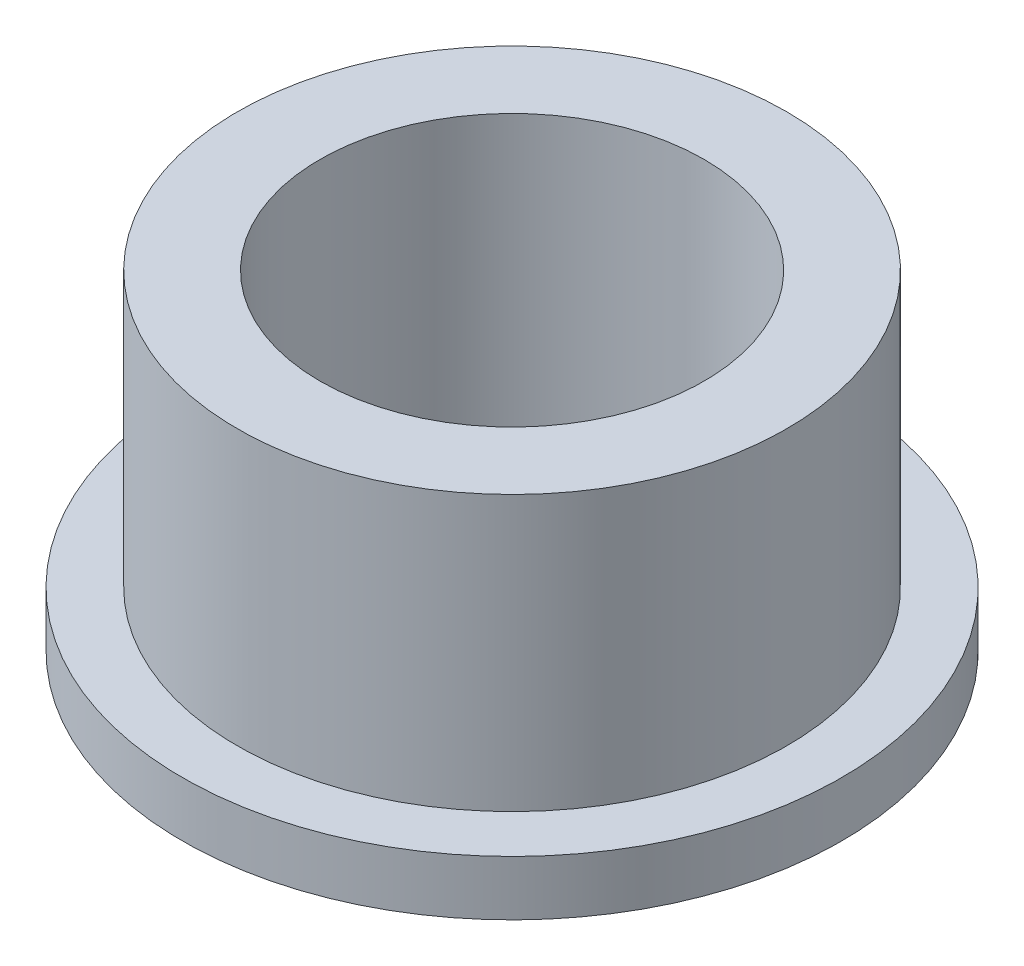
ISO-10303-21;
HEADER;
FILE_DESCRIPTION(('STEP AP214'),'2;1');
FILE_NAME('part.step','',(''),(''),'','','');
FILE_SCHEMA(('AUTOMOTIVE_DESIGN { 1 0 10303 214 1 1 1 1 }'));
ENDSEC;
DATA;
#1=APPLICATION_CONTEXT('core data for automotive mechanical design processes');
#2=APPLICATION_PROTOCOL_DEFINITION('international standard','automotive_design',2000,#1);
#3=PRODUCT_CONTEXT('',#1,'mechanical');
#4=PRODUCT('Part','Part','',(#3));
#5=PRODUCT_RELATED_PRODUCT_CATEGORY('part','',(#4));
#6=PRODUCT_DEFINITION_FORMATION('','',#4);
#7=PRODUCT_DEFINITION_CONTEXT('part definition',#1,'design');
#8=PRODUCT_DEFINITION('design','',#6,#7);
#9=PRODUCT_DEFINITION_SHAPE('','',#8);
#10=(LENGTH_UNIT() NAMED_UNIT(*) SI_UNIT(.MILLI.,.METRE.));
#11=(NAMED_UNIT(*) PLANE_ANGLE_UNIT() SI_UNIT($,.RADIAN.));
#12=(NAMED_UNIT(*) SI_UNIT($,.STERADIAN.) SOLID_ANGLE_UNIT());
#13=UNCERTAINTY_MEASURE_WITH_UNIT(LENGTH_MEASURE(1.E-05),#10,'distance_accuracy_value','');
#14=(GEOMETRIC_REPRESENTATION_CONTEXT(3) GLOBAL_UNCERTAINTY_ASSIGNED_CONTEXT((#13)) GLOBAL_UNIT_ASSIGNED_CONTEXT((#10,
#11,#12)) REPRESENTATION_CONTEXT('',''));
#15=CARTESIAN_POINT('',(0.,0.,0.));
#16=DIRECTION('',(0.,0.,1.));
#17=DIRECTION('',(1.,0.,0.));
#18=AXIS2_PLACEMENT_3D('',#15,#16,#17);
#19=CARTESIAN_POINT('',(0.,19.05,0.));
#20=DIRECTION('',(0.,-1.,0.));
#21=DIRECTION('',(0.,0.,-1.));
#22=AXIS2_PLACEMENT_3D('',#19,#20,#21);
#23=CYLINDRICAL_SURFACE('',#22,15.875);
#24=CARTESIAN_POINT('',(0.,19.05,0.));
#25=DIRECTION('',(0.,1.,0.));
#26=DIRECTION('',(0.,0.,1.));
#27=AXIS2_PLACEMENT_3D('',#24,#25,#26);
#28=CIRCLE('',#27,15.875);
#29=CARTESIAN_POINT('',(0.,19.05,-15.875));
#30=VERTEX_POINT('',#29);
#31=EDGE_CURVE('E37',#30,#30,#28,.T.);
#32=CARTESIAN_POINT('',(0.,3.175,0.));
#33=DIRECTION('',(0.,-1.,0.));
#34=DIRECTION('',(0.,0.,-1.));
#35=AXIS2_PLACEMENT_3D('',#32,#33,#34);
#36=CIRCLE('',#35,15.875);
#37=CARTESIAN_POINT('',(0.,3.175,-15.875));
#38=VERTEX_POINT('',#37);
#39=EDGE_CURVE('E10',#38,#38,#36,.T.);
#40=CARTESIAN_POINT('',(0.,19.05,-15.875));
#41=CARTESIAN_POINT('',(0.,18.8846354166667,-15.875));
#42=CARTESIAN_POINT('',(0.,18.7192708333333,-15.875));
#43=CARTESIAN_POINT('',(0.,18.3885416666667,-15.875));
#44=CARTESIAN_POINT('',(0.,18.2231770833333,-15.875));
#45=CARTESIAN_POINT('',(0.,17.8924479166667,-15.875));
#46=CARTESIAN_POINT('',(0.,17.7270833333333,-15.875));
#47=CARTESIAN_POINT('',(0.,17.3963541666667,-15.875));
#48=CARTESIAN_POINT('',(0.,17.2309895833333,-15.875));
#49=CARTESIAN_POINT('',(0.,16.9002604166667,-15.875));
#50=CARTESIAN_POINT('',(0.,16.7348958333333,-15.875));
#51=CARTESIAN_POINT('',(0.,16.4041666666667,-15.875));
#52=CARTESIAN_POINT('',(0.,16.2388020833333,-15.875));
#53=CARTESIAN_POINT('',(0.,15.9080729166667,-15.875));
#54=CARTESIAN_POINT('',(0.,15.7427083333333,-15.875));
#55=CARTESIAN_POINT('',(0.,15.4119791666667,-15.875));
#56=CARTESIAN_POINT('',(0.,15.2466145833333,-15.875));
#57=CARTESIAN_POINT('',(0.,14.9158854166667,-15.875));
#58=CARTESIAN_POINT('',(0.,14.7505208333333,-15.875));
#59=CARTESIAN_POINT('',(0.,14.4197916666667,-15.875));
#60=CARTESIAN_POINT('',(0.,14.2544270833333,-15.875));
#61=CARTESIAN_POINT('',(0.,13.9236979166667,-15.875));
#62=CARTESIAN_POINT('',(0.,13.7583333333333,-15.875));
#63=CARTESIAN_POINT('',(0.,13.4276041666667,-15.875));
#64=CARTESIAN_POINT('',(0.,13.2622395833333,-15.875));
#65=CARTESIAN_POINT('',(0.,12.9315104166667,-15.875));
#66=CARTESIAN_POINT('',(0.,12.7661458333333,-15.875));
#67=CARTESIAN_POINT('',(0.,12.4354166666667,-15.875));
#68=CARTESIAN_POINT('',(0.,12.2700520833333,-15.875));
#69=CARTESIAN_POINT('',(0.,11.9393229166667,-15.875));
#70=CARTESIAN_POINT('',(0.,11.7739583333333,-15.875));
#71=CARTESIAN_POINT('',(0.,11.4432291666667,-15.875));
#72=CARTESIAN_POINT('',(0.,11.2778645833333,-15.875));
#73=CARTESIAN_POINT('',(0.,10.9471354166667,-15.875));
#74=CARTESIAN_POINT('',(0.,10.7817708333333,-15.875));
#75=CARTESIAN_POINT('',(0.,10.4510416666667,-15.875));
#76=CARTESIAN_POINT('',(0.,10.2856770833333,-15.875));
#77=CARTESIAN_POINT('',(0.,9.95494791666667,-15.875));
#78=CARTESIAN_POINT('',(0.,9.78958333333333,-15.875));
#79=CARTESIAN_POINT('',(0.,9.45885416666667,-15.875));
#80=CARTESIAN_POINT('',(0.,9.29348958333333,-15.875));
#81=CARTESIAN_POINT('',(0.,8.96276041666667,-15.875));
#82=CARTESIAN_POINT('',(0.,8.79739583333333,-15.875));
#83=CARTESIAN_POINT('',(0.,8.46666666666667,-15.875));
#84=CARTESIAN_POINT('',(0.,8.30130208333333,-15.875));
#85=CARTESIAN_POINT('',(0.,7.97057291666667,-15.875));
#86=CARTESIAN_POINT('',(0.,7.80520833333333,-15.875));
#87=CARTESIAN_POINT('',(0.,7.47447916666667,-15.875));
#88=CARTESIAN_POINT('',(0.,7.30911458333333,-15.875));
#89=CARTESIAN_POINT('',(0.,6.97838541666667,-15.875));
#90=CARTESIAN_POINT('',(0.,6.81302083333333,-15.875));
#91=CARTESIAN_POINT('',(0.,6.48229166666667,-15.875));
#92=CARTESIAN_POINT('',(0.,6.31692708333333,-15.875));
#93=CARTESIAN_POINT('',(0.,5.98619791666667,-15.875));
#94=CARTESIAN_POINT('',(0.,5.82083333333333,-15.875));
#95=CARTESIAN_POINT('',(0.,5.49010416666667,-15.875));
#96=CARTESIAN_POINT('',(0.,5.32473958333333,-15.875));
#97=CARTESIAN_POINT('',(0.,4.99401041666667,-15.875));
#98=CARTESIAN_POINT('',(0.,4.82864583333333,-15.875));
#99=CARTESIAN_POINT('',(0.,4.49791666666667,-15.875));
#100=CARTESIAN_POINT('',(0.,4.33255208333333,-15.875));
#101=CARTESIAN_POINT('',(0.,4.00182291666667,-15.875));
#102=CARTESIAN_POINT('',(0.,3.83645833333333,-15.875));
#103=CARTESIAN_POINT('',(0.,3.50572916666667,-15.875));
#104=CARTESIAN_POINT('',(0.,3.34036458333334,-15.875));
#105=CARTESIAN_POINT('',(0.,3.175,-15.875));
#106=B_SPLINE_CURVE_WITH_KNOTS('',3,(#40,#41,#42,#43,#44,#45,#46,#47,#48,#49,#50,#51,#52,#53,
#54,#55,#56,#57,#58,#59,#60,#61,#62,#63,#64,#65,#66,#67,#68,#69,#70,#71,#72,#73,#74,#75,#76,#77,
#78,#79,#80,#81,#82,#83,#84,#85,#86,#87,#88,#89,#90,#91,#92,#93,#94,#95,#96,#97,#98,#99,#100,
#101,#102,#103,#104,#105),.UNSPECIFIED.,.F.,.F.,(4,2,2,2,2,2,2,2,2,2,2,2,2,2,2,2,2,2,2,2,2,2,2,
2,2,2,2,2,2,2,2,2,4),(0.,0.496093750000003,0.992187500000002,1.48828125,1.984375,2.48046875,
2.9765625,3.47265625,3.96875,4.46484375,4.9609375,5.45703125,5.953125,6.44921875,6.9453125,
7.44140625,7.9375,8.43359375,8.9296875,9.42578125,9.921875,10.41796875,10.9140625,11.41015625,
11.90625,12.40234375,12.8984375,13.39453125,13.890625,14.38671875,14.8828125,15.37890625,
15.875),.UNSPECIFIED.);
#107=EDGE_CURVE('BSEAM31',#30,#38,#106,.T.);
#108=ORIENTED_EDGE('',*,*,#31,.F.);
#109=ORIENTED_EDGE('',*,*,#39,.F.);
#110=ORIENTED_EDGE('',*,*,#107,.T.);
#111=ORIENTED_EDGE('',*,*,#107,.F.);
#112=EDGE_LOOP('',(#108,#110,#109,#111));
#113=FACE_BOUND('',#112,.T.);
#114=ADVANCED_FACE('F31',(#113),#23,.T.);
#115=CARTESIAN_POINT('',(0.,19.05,0.));
#116=DIRECTION('',(0.,1.,0.));
#117=DIRECTION('',(0.,0.,1.));
#118=AXIS2_PLACEMENT_3D('',#115,#116,#117);
#119=PLANE('',#118);
#120=ORIENTED_EDGE('',*,*,#31,.T.);
#121=EDGE_LOOP('',(#120));
#122=FACE_BOUND('',#121,.T.);
#123=CARTESIAN_POINT('',(0.,19.05,0.));
#124=DIRECTION('',(0.,1.,0.));
#125=DIRECTION('',(0.,0.,1.));
#126=AXIS2_PLACEMENT_3D('',#123,#124,#125);
#127=CIRCLE('',#126,11.1024178615761);
#128=CARTESIAN_POINT('',(0.,19.05,-11.1024178615761));
#129=VERTEX_POINT('',#128);
#130=EDGE_CURVE('E41',#129,#129,#127,.T.);
#131=ORIENTED_EDGE('',*,*,#130,.F.);
#132=EDGE_LOOP('',(#131));
#133=FACE_BOUND('',#132,.T.);
#134=ADVANCED_FACE('F69',(#122,#133),#119,.T.);
#135=CARTESIAN_POINT('',(0.,0.,0.));
#136=DIRECTION('',(0.,1.,0.));
#137=DIRECTION('',(0.,0.,1.));
#138=AXIS2_PLACEMENT_3D('',#135,#136,#137);
#139=PLANE('',#138);
#140=CARTESIAN_POINT('',(0.,0.,0.));
#141=DIRECTION('',(0.,1.,0.));
#142=DIRECTION('',(0.,0.,1.));
#143=AXIS2_PLACEMENT_3D('',#140,#141,#142);
#144=CIRCLE('',#143,11.1024178615761);
#145=CARTESIAN_POINT('',(0.,0.,-11.1024178615761));
#146=VERTEX_POINT('',#145);
#147=EDGE_CURVE('E45',#146,#146,#144,.T.);
#148=ORIENTED_EDGE('',*,*,#147,.T.);
#149=EDGE_LOOP('',(#148));
#150=FACE_BOUND('',#149,.T.);
#151=CARTESIAN_POINT('',(0.,0.,0.));
#152=DIRECTION('',(0.,-1.,0.));
#153=DIRECTION('',(0.,0.,-1.));
#154=AXIS2_PLACEMENT_3D('',#151,#152,#153);
#155=CIRCLE('',#154,19.05);
#156=CARTESIAN_POINT('',(0.,0.,-19.05));
#157=VERTEX_POINT('',#156);
#158=EDGE_CURVE('E51',#157,#157,#155,.T.);
#159=ORIENTED_EDGE('',*,*,#158,.T.);
#160=EDGE_LOOP('',(#159));
#161=FACE_BOUND('',#160,.T.);
#162=ADVANCED_FACE('F74',(#150,#161),#139,.F.);
#163=CARTESIAN_POINT('',(0.,19.05,0.));
#164=DIRECTION('',(0.,-1.,0.));
#165=DIRECTION('',(0.,0.,-1.));
#166=AXIS2_PLACEMENT_3D('',#163,#164,#165);
#167=CYLINDRICAL_SURFACE('',#166,11.1024178615761);
#168=CARTESIAN_POINT('',(0.,19.05,-11.1024178615761));
#169=CARTESIAN_POINT('',(0.,18.8515625,-11.1024178615761));
#170=CARTESIAN_POINT('',(0.,18.653125,-11.1024178615761));
#171=CARTESIAN_POINT('',(0.,18.25625,-11.1024178615761));
#172=CARTESIAN_POINT('',(0.,18.0578125,-11.1024178615761));
#173=CARTESIAN_POINT('',(0.,17.6609375,-11.1024178615761));
#174=CARTESIAN_POINT('',(0.,17.4625,-11.1024178615761));
#175=CARTESIAN_POINT('',(0.,17.065625,-11.1024178615761));
#176=CARTESIAN_POINT('',(0.,16.8671875,-11.1024178615761));
#177=CARTESIAN_POINT('',(0.,16.4703125,-11.1024178615761));
#178=CARTESIAN_POINT('',(0.,16.271875,-11.1024178615761));
#179=CARTESIAN_POINT('',(0.,15.875,-11.1024178615761));
#180=CARTESIAN_POINT('',(0.,15.6765625,-11.1024178615761));
#181=CARTESIAN_POINT('',(0.,15.2796875,-11.1024178615761));
#182=CARTESIAN_POINT('',(0.,15.08125,-11.1024178615761));
#183=CARTESIAN_POINT('',(0.,14.684375,-11.1024178615761));
#184=CARTESIAN_POINT('',(0.,14.4859375,-11.1024178615761));
#185=CARTESIAN_POINT('',(0.,14.0890625,-11.1024178615761));
#186=CARTESIAN_POINT('',(0.,13.890625,-11.1024178615761));
#187=CARTESIAN_POINT('',(0.,13.49375,-11.1024178615761));
#188=CARTESIAN_POINT('',(0.,13.2953125,-11.1024178615761));
#189=CARTESIAN_POINT('',(0.,12.8984375,-11.1024178615761));
#190=CARTESIAN_POINT('',(0.,12.7,-11.1024178615761));
#191=CARTESIAN_POINT('',(0.,12.303125,-11.1024178615761));
#192=CARTESIAN_POINT('',(0.,12.1046875,-11.1024178615761));
#193=CARTESIAN_POINT('',(0.,11.7078125,-11.1024178615761));
#194=CARTESIAN_POINT('',(0.,11.509375,-11.1024178615761));
#195=CARTESIAN_POINT('',(0.,11.1125,-11.1024178615761));
#196=CARTESIAN_POINT('',(0.,10.9140625,-11.1024178615761));
#197=CARTESIAN_POINT('',(0.,10.5171875,-11.1024178615761));
#198=CARTESIAN_POINT('',(0.,10.31875,-11.1024178615761));
#199=CARTESIAN_POINT('',(0.,9.921875,-11.1024178615761));
#200=CARTESIAN_POINT('',(0.,9.7234375,-11.1024178615761));
#201=CARTESIAN_POINT('',(0.,9.3265625,-11.1024178615761));
#202=CARTESIAN_POINT('',(0.,9.128125,-11.1024178615761));
#203=CARTESIAN_POINT('',(0.,8.73125,-11.1024178615761));
#204=CARTESIAN_POINT('',(0.,8.5328125,-11.1024178615761));
#205=CARTESIAN_POINT('',(0.,8.1359375,-11.1024178615761));
#206=CARTESIAN_POINT('',(0.,7.9375,-11.1024178615761));
#207=CARTESIAN_POINT('',(0.,7.540625,-11.1024178615761));
#208=CARTESIAN_POINT('',(0.,7.3421875,-11.1024178615761));
#209=CARTESIAN_POINT('',(0.,6.9453125,-11.1024178615761));
#210=CARTESIAN_POINT('',(0.,6.746875,-11.1024178615761));
#211=CARTESIAN_POINT('',(0.,6.35,-11.1024178615761));
#212=CARTESIAN_POINT('',(0.,6.1515625,-11.1024178615761));
#213=CARTESIAN_POINT('',(0.,5.7546875,-11.1024178615761));
#214=CARTESIAN_POINT('',(0.,5.55625,-11.1024178615761));
#215=CARTESIAN_POINT('',(0.,5.159375,-11.1024178615761));
#216=CARTESIAN_POINT('',(0.,4.9609375,-11.1024178615761));
#217=CARTESIAN_POINT('',(0.,4.5640625,-11.1024178615761));
#218=CARTESIAN_POINT('',(0.,4.365625,-11.1024178615761));
#219=CARTESIAN_POINT('',(0.,3.96875,-11.1024178615761));
#220=CARTESIAN_POINT('',(0.,3.7703125,-11.1024178615761));
#221=CARTESIAN_POINT('',(0.,3.3734375,-11.1024178615761));
#222=CARTESIAN_POINT('',(0.,3.175,-11.1024178615761));
#223=CARTESIAN_POINT('',(0.,2.778125,-11.1024178615761));
#224=CARTESIAN_POINT('',(0.,2.5796875,-11.1024178615761));
#225=CARTESIAN_POINT('',(0.,2.1828125,-11.1024178615761));
#226=CARTESIAN_POINT('',(0.,1.984375,-11.1024178615761));
#227=CARTESIAN_POINT('',(0.,1.5875,-11.1024178615761));
#228=CARTESIAN_POINT('',(0.,1.3890625,-11.1024178615761));
#229=CARTESIAN_POINT('',(0.,0.992187500000001,-11.1024178615761));
#230=CARTESIAN_POINT('',(0.,0.793750000000001,-11.1024178615761));
#231=CARTESIAN_POINT('',(0.,0.396875,-11.1024178615761));
#232=CARTESIAN_POINT('',(0.,0.1984375,-11.1024178615761));
#233=CARTESIAN_POINT('',(0.,0.,-11.1024178615761));
#234=B_SPLINE_CURVE_WITH_KNOTS('',3,(#168,#169,#170,#171,#172,#173,#174,#175,#176,#177,#178,
#179,#180,#181,#182,#183,#184,#185,#186,#187,#188,#189,#190,#191,#192,#193,#194,#195,#196,#197,
#198,#199,#200,#201,#202,#203,#204,#205,#206,#207,#208,#209,#210,#211,#212,#213,#214,#215,#216,
#217,#218,#219,#220,#221,#222,#223,#224,#225,#226,#227,#228,#229,#230,#231,#232,#233),
.UNSPECIFIED.,.F.,.F.,(4,2,2,2,2,2,2,2,2,2,2,2,2,2,2,2,2,2,2,2,2,2,2,2,2,2,2,2,2,2,2,2,4),(0.,
0.5953125,1.190625,1.7859375,2.38125,2.9765625,3.571875,4.1671875,4.7625,5.3578125,5.953125,
6.5484375,7.14375,7.7390625,8.334375,8.9296875,9.525,10.1203125,10.715625,11.3109375,11.90625,
12.5015625,13.096875,13.6921875,14.2875,14.8828125,15.478125,16.0734375,16.66875,17.2640625,
17.859375,18.4546875,19.05),.UNSPECIFIED.);
#235=EDGE_CURVE('BSEAM66',#129,#146,#234,.T.);
#236=ORIENTED_EDGE('',*,*,#130,.T.);
#237=ORIENTED_EDGE('',*,*,#147,.F.);
#238=ORIENTED_EDGE('',*,*,#235,.T.);
#239=ORIENTED_EDGE('',*,*,#235,.F.);
#240=EDGE_LOOP('',(#236,#238,#237,#239));
#241=FACE_BOUND('',#240,.T.);
#242=ADVANCED_FACE('F66',(#241),#167,.F.);
#243=CARTESIAN_POINT('',(0.,3.175,0.));
#244=DIRECTION('',(0.,-1.,0.));
#245=DIRECTION('',(0.,0.,-1.));
#246=AXIS2_PLACEMENT_3D('',#243,#244,#245);
#247=CYLINDRICAL_SURFACE('',#246,19.05);
#248=CARTESIAN_POINT('',(0.,3.175,0.));
#249=DIRECTION('',(0.,-1.,0.));
#250=DIRECTION('',(0.,0.,-1.));
#251=AXIS2_PLACEMENT_3D('',#248,#249,#250);
#252=CIRCLE('',#251,19.05);
#253=CARTESIAN_POINT('',(0.,3.175,-19.05));
#254=VERTEX_POINT('',#253);
#255=EDGE_CURVE('E49',#254,#254,#252,.T.);
#256=ORIENTED_EDGE('',*,*,#255,.T.);
#257=EDGE_LOOP('',(#256));
#258=FACE_BOUND('',#257,.T.);
#259=ORIENTED_EDGE('',*,*,#158,.F.);
#260=EDGE_LOOP('',(#259));
#261=FACE_BOUND('',#260,.T.);
#262=ADVANCED_FACE('F57',(#258,#261),#247,.T.);
#263=CARTESIAN_POINT('',(0.,3.175,0.));
#264=DIRECTION('',(0.,-1.,0.));
#265=DIRECTION('',(0.,0.,-1.));
#266=AXIS2_PLACEMENT_3D('',#263,#264,#265);
#267=PLANE('',#266);
#268=ORIENTED_EDGE('',*,*,#39,.T.);
#269=EDGE_LOOP('',(#268));
#270=FACE_BOUND('',#269,.T.);
#271=ORIENTED_EDGE('',*,*,#255,.F.);
#272=EDGE_LOOP('',(#271));
#273=FACE_BOUND('',#272,.T.);
#274=ADVANCED_FACE('F60',(#270,#273),#267,.F.);
#275=CLOSED_SHELL('',(#114,#134,#162,#242,#262,#274));
#276=MANIFOLD_SOLID_BREP('B2',#275);
#277=ADVANCED_BREP_SHAPE_REPRESENTATION('',(#18,#276),#14);
#278=SHAPE_DEFINITION_REPRESENTATION(#9,#277);
ENDSEC;
END-ISO-10303-21;
